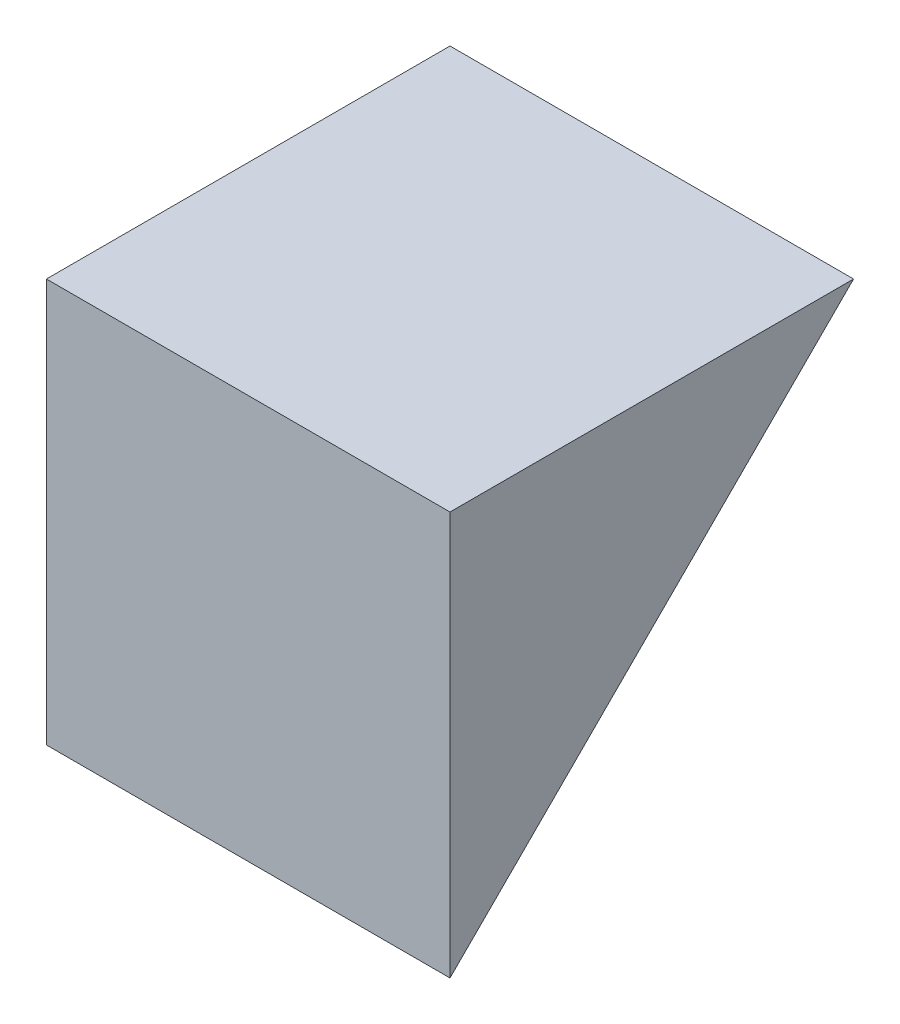
ISO-10303-21;
HEADER;
FILE_DESCRIPTION(('STEP AP214'),'2;1');
FILE_NAME('part.step','',(''),(''),'','','');
FILE_SCHEMA(('AUTOMOTIVE_DESIGN { 1 0 10303 214 1 1 1 1 }'));
ENDSEC;
DATA;
#1=APPLICATION_CONTEXT('core data for automotive mechanical design processes');
#2=APPLICATION_PROTOCOL_DEFINITION('international standard','automotive_design',2000,#1);
#3=PRODUCT_CONTEXT('',#1,'mechanical');
#4=PRODUCT('Part','Part','',(#3));
#5=PRODUCT_RELATED_PRODUCT_CATEGORY('part','',(#4));
#6=PRODUCT_DEFINITION_FORMATION('','',#4);
#7=PRODUCT_DEFINITION_CONTEXT('part definition',#1,'design');
#8=PRODUCT_DEFINITION('design','',#6,#7);
#9=PRODUCT_DEFINITION_SHAPE('','',#8);
#10=(LENGTH_UNIT() NAMED_UNIT(*) SI_UNIT(.MILLI.,.METRE.));
#11=(NAMED_UNIT(*) PLANE_ANGLE_UNIT() SI_UNIT($,.RADIAN.));
#12=(NAMED_UNIT(*) SI_UNIT($,.STERADIAN.) SOLID_ANGLE_UNIT());
#13=UNCERTAINTY_MEASURE_WITH_UNIT(LENGTH_MEASURE(1.E-05),#10,'distance_accuracy_value','');
#14=(GEOMETRIC_REPRESENTATION_CONTEXT(3) GLOBAL_UNCERTAINTY_ASSIGNED_CONTEXT((#13)) GLOBAL_UNIT_ASSIGNED_CONTEXT((#10,
#11,#12)) REPRESENTATION_CONTEXT('',''));
#15=CARTESIAN_POINT('',(0.,0.,0.));
#16=DIRECTION('',(0.,0.,1.));
#17=DIRECTION('',(1.,0.,0.));
#18=AXIS2_PLACEMENT_3D('',#15,#16,#17);
#19=CARTESIAN_POINT('',(40.,-40.,40.));
#20=DIRECTION('',(0.,0.707106781186547,0.707106781186548));
#21=DIRECTION('',(0.,-0.707106781186548,0.707106781186547));
#22=AXIS2_PLACEMENT_3D('',#19,#20,#21);
#23=PLANE('',#22);
#24=DIRECTION('',(0.,0.707106781186548,-0.707106781186547));
#25=VECTOR('',#24,1.);
#26=CARTESIAN_POINT('',(0.,-40.,40.));
#27=LINE('',#26,#25);
#28=CARTESIAN_POINT('',(0.,-40.,40.));
#29=VERTEX_POINT('',#28);
#30=CARTESIAN_POINT('',(0.,0.,0.));
#31=VERTEX_POINT('',#30);
#32=EDGE_CURVE('E89',#29,#31,#27,.T.);
#33=ORIENTED_EDGE('',*,*,#32,.T.);
#34=DIRECTION('',(-1.,0.,0.));
#35=VECTOR('',#34,1.);
#36=CARTESIAN_POINT('',(40.,0.,0.));
#37=LINE('',#36,#35);
#38=CARTESIAN_POINT('',(40.,0.,0.));
#39=VERTEX_POINT('',#38);
#40=EDGE_CURVE('E11',#39,#31,#37,.T.);
#41=ORIENTED_EDGE('',*,*,#40,.F.);
#42=DIRECTION('',(0.,0.707106781186548,-0.707106781186547));
#43=VECTOR('',#42,1.);
#44=CARTESIAN_POINT('',(40.,-40.,40.));
#45=LINE('',#44,#43);
#46=CARTESIAN_POINT('',(40.,-40.,40.));
#47=VERTEX_POINT('',#46);
#48=EDGE_CURVE('E81',#47,#39,#45,.T.);
#49=ORIENTED_EDGE('',*,*,#48,.F.);
#50=DIRECTION('',(-1.,0.,0.));
#51=VECTOR('',#50,1.);
#52=CARTESIAN_POINT('',(40.,-40.,40.));
#53=LINE('',#52,#51);
#54=EDGE_CURVE('E90',#47,#29,#53,.T.);
#55=ORIENTED_EDGE('',*,*,#54,.T.);
#56=EDGE_LOOP('',(#33,#41,#49,#55));
#57=FACE_BOUND('',#56,.T.);
#58=ADVANCED_FACE('F39',(#57),#23,.F.);
#59=CARTESIAN_POINT('',(40.,0.,0.));
#60=DIRECTION('',(0.,-1.,0.));
#61=DIRECTION('',(0.,0.,-1.));
#62=AXIS2_PLACEMENT_3D('',#59,#60,#61);
#63=PLANE('',#62);
#64=DIRECTION('',(0.,0.,1.));
#65=VECTOR('',#64,1.);
#66=CARTESIAN_POINT('',(0.,0.,0.));
#67=LINE('',#66,#65);
#68=CARTESIAN_POINT('',(0.,0.,40.));
#69=VERTEX_POINT('',#68);
#70=EDGE_CURVE('E68',#31,#69,#67,.T.);
#71=ORIENTED_EDGE('',*,*,#70,.T.);
#72=DIRECTION('',(-1.,0.,0.));
#73=VECTOR('',#72,1.);
#74=CARTESIAN_POINT('',(40.,0.,40.));
#75=LINE('',#74,#73);
#76=CARTESIAN_POINT('',(40.,0.,40.));
#77=VERTEX_POINT('',#76);
#78=EDGE_CURVE('E48',#77,#69,#75,.T.);
#79=ORIENTED_EDGE('',*,*,#78,.F.);
#80=DIRECTION('',(0.,0.,1.));
#81=VECTOR('',#80,1.);
#82=CARTESIAN_POINT('',(40.,0.,0.));
#83=LINE('',#82,#81);
#84=EDGE_CURVE('E76',#39,#77,#83,.T.);
#85=ORIENTED_EDGE('',*,*,#84,.F.);
#86=ORIENTED_EDGE('',*,*,#40,.T.);
#87=EDGE_LOOP('',(#71,#79,#85,#86));
#88=FACE_BOUND('',#87,.T.);
#89=ADVANCED_FACE('F77',(#88),#63,.F.);
#90=CARTESIAN_POINT('',(40.,0.,40.));
#91=DIRECTION('',(0.,0.,-1.));
#92=DIRECTION('',(0.,1.,0.));
#93=AXIS2_PLACEMENT_3D('',#90,#91,#92);
#94=PLANE('',#93);
#95=DIRECTION('',(0.,-1.,0.));
#96=VECTOR('',#95,1.);
#97=CARTESIAN_POINT('',(0.,0.,40.));
#98=LINE('',#97,#96);
#99=EDGE_CURVE('E73',#69,#29,#98,.T.);
#100=ORIENTED_EDGE('',*,*,#99,.T.);
#101=ORIENTED_EDGE('',*,*,#54,.F.);
#102=DIRECTION('',(0.,-1.,0.));
#103=VECTOR('',#102,1.);
#104=CARTESIAN_POINT('',(40.,0.,40.));
#105=LINE('',#104,#103);
#106=EDGE_CURVE('E56',#77,#47,#105,.T.);
#107=ORIENTED_EDGE('',*,*,#106,.F.);
#108=ORIENTED_EDGE('',*,*,#78,.T.);
#109=EDGE_LOOP('',(#100,#101,#107,#108));
#110=FACE_BOUND('',#109,.T.);
#111=ADVANCED_FACE('F102',(#110),#94,.F.);
#112=CARTESIAN_POINT('',(40.,0.,0.));
#113=DIRECTION('',(1.,0.,0.));
#114=DIRECTION('',(0.,0.,-1.));
#115=AXIS2_PLACEMENT_3D('',#112,#113,#114);
#116=PLANE('',#115);
#117=ORIENTED_EDGE('',*,*,#48,.T.);
#118=ORIENTED_EDGE('',*,*,#84,.T.);
#119=ORIENTED_EDGE('',*,*,#106,.T.);
#120=EDGE_LOOP('',(#117,#118,#119));
#121=FACE_BOUND('',#120,.T.);
#122=ADVANCED_FACE('F84',(#121),#116,.T.);
#123=CARTESIAN_POINT('',(0.,0.,0.));
#124=DIRECTION('',(1.,0.,0.));
#125=DIRECTION('',(0.,0.,-1.));
#126=AXIS2_PLACEMENT_3D('',#123,#124,#125);
#127=PLANE('',#126);
#128=ORIENTED_EDGE('',*,*,#32,.F.);
#129=ORIENTED_EDGE('',*,*,#99,.F.);
#130=ORIENTED_EDGE('',*,*,#70,.F.);
#131=EDGE_LOOP('',(#128,#129,#130));
#132=FACE_BOUND('',#131,.T.);
#133=ADVANCED_FACE('F103',(#132),#127,.F.);
#134=CLOSED_SHELL('',(#58,#89,#111,#122,#133));
#135=MANIFOLD_SOLID_BREP('B2',#134);
#136=ADVANCED_BREP_SHAPE_REPRESENTATION('',(#18,#135),#14);
#137=SHAPE_DEFINITION_REPRESENTATION(#9,#136);
ENDSEC;
END-ISO-10303-21;
